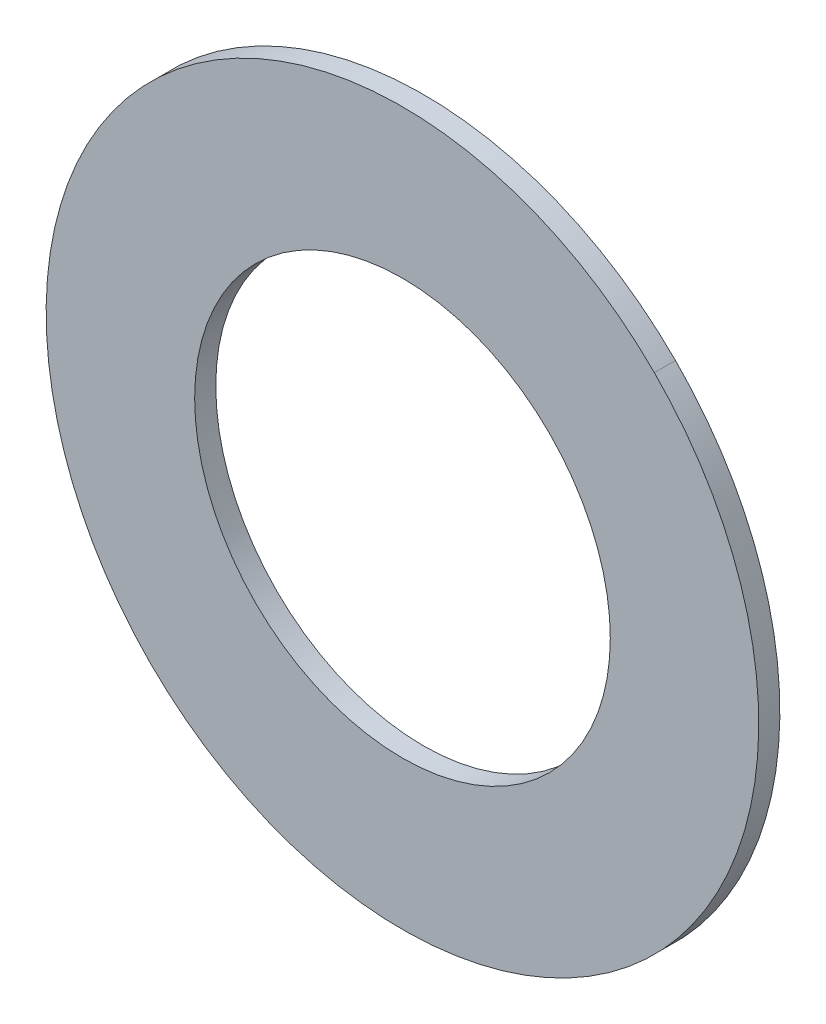
ISO-10303-21;
HEADER;
FILE_DESCRIPTION(('STEP AP214'),'2;1');
FILE_NAME('part.step','',(''),(''),'','','');
FILE_SCHEMA(('AUTOMOTIVE_DESIGN { 1 0 10303 214 1 1 1 1 }'));
ENDSEC;
DATA;
#1=APPLICATION_CONTEXT('core data for automotive mechanical design processes');
#2=APPLICATION_PROTOCOL_DEFINITION('international standard','automotive_design',2000,#1);
#3=PRODUCT_CONTEXT('',#1,'mechanical');
#4=PRODUCT('Part','Part','',(#3));
#5=PRODUCT_RELATED_PRODUCT_CATEGORY('part','',(#4));
#6=PRODUCT_DEFINITION_FORMATION('','',#4);
#7=PRODUCT_DEFINITION_CONTEXT('part definition',#1,'design');
#8=PRODUCT_DEFINITION('design','',#6,#7);
#9=PRODUCT_DEFINITION_SHAPE('','',#8);
#10=(LENGTH_UNIT() NAMED_UNIT(*) SI_UNIT(.MILLI.,.METRE.));
#11=(NAMED_UNIT(*) PLANE_ANGLE_UNIT() SI_UNIT($,.RADIAN.));
#12=(NAMED_UNIT(*) SI_UNIT($,.STERADIAN.) SOLID_ANGLE_UNIT());
#13=UNCERTAINTY_MEASURE_WITH_UNIT(LENGTH_MEASURE(1.E-05),#10,'distance_accuracy_value','');
#14=(GEOMETRIC_REPRESENTATION_CONTEXT(3) GLOBAL_UNCERTAINTY_ASSIGNED_CONTEXT((#13)) GLOBAL_UNIT_ASSIGNED_CONTEXT((#10,
#11,#12)) REPRESENTATION_CONTEXT('',''));
#15=CARTESIAN_POINT('',(0.,0.,0.));
#16=DIRECTION('',(0.,0.,1.));
#17=DIRECTION('',(1.,0.,0.));
#18=AXIS2_PLACEMENT_3D('',#15,#16,#17);
#19=CARTESIAN_POINT('',(114.90900818,94.87582498,0.));
#20=DIRECTION('',(0.707106781235999,0.707106781137096,0.));
#21=DIRECTION('',(0.707106781137096,-0.707106781235999,0.));
#22=AXIS2_PLACEMENT_3D('',#19,#20,#21);
#23=PLANE('',#22);
#24=DIRECTION('',(0.707106781137096,-0.707106781235999,0.));
#25=VECTOR('',#24,1.);
#26=CARTESIAN_POINT('',(114.90900818,94.87582498,0.03556));
#27=LINE('',#26,#25);
#28=CARTESIAN_POINT('',(114.90900818,94.87582498,0.03556));
#29=VERTEX_POINT('',#28);
#30=CARTESIAN_POINT('',(114.90910978,94.87572338,0.03556));
#31=VERTEX_POINT('',#30);
#32=EDGE_CURVE('E11',#29,#31,#27,.T.);
#33=ORIENTED_EDGE('',*,*,#32,.F.);
#34=DIRECTION('',(0.,0.,1.));
#35=VECTOR('',#34,1.);
#36=CARTESIAN_POINT('',(114.90900818,94.87582498,0.));
#37=LINE('',#36,#35);
#38=CARTESIAN_POINT('',(114.90900818,94.87582498,0.));
#39=VERTEX_POINT('',#38);
#40=EDGE_CURVE('E24',#39,#29,#37,.T.);
#41=ORIENTED_EDGE('',*,*,#40,.F.);
#42=DIRECTION('',(0.707106781137096,-0.707106781235999,0.));
#43=VECTOR('',#42,1.);
#44=CARTESIAN_POINT('',(114.90900818,94.87582498,0.));
#45=LINE('',#44,#43);
#46=CARTESIAN_POINT('',(114.90910978,94.87572338,0.));
#47=VERTEX_POINT('',#46);
#48=EDGE_CURVE('E96',#39,#47,#45,.T.);
#49=ORIENTED_EDGE('',*,*,#48,.T.);
#50=DIRECTION('',(0.,0.,1.));
#51=VECTOR('',#50,1.);
#52=CARTESIAN_POINT('',(114.90910978,94.87572338,0.));
#53=LINE('',#52,#51);
#54=EDGE_CURVE('E37',#47,#31,#53,.T.);
#55=ORIENTED_EDGE('',*,*,#54,.T.);
#56=EDGE_LOOP('',(#33,#41,#49,#55));
#57=FACE_BOUND('',#56,.T.);
#58=ADVANCED_FACE('F17',(#57),#23,.F.);
#59=CARTESIAN_POINT('',(115.333272,95.3000888,0.));
#60=DIRECTION('',(0.,0.,-1.));
#61=DIRECTION('',(0.707106781186548,0.707106781186548,0.));
#62=AXIS2_PLACEMENT_3D('',#59,#60,#61);
#63=CYLINDRICAL_SURFACE('',#62,0.599999648268208);
#64=CARTESIAN_POINT('',(115.333272,95.3000888,0.03556));
#65=DIRECTION('',(0.,0.,1.));
#66=DIRECTION('',(0.707106781186548,0.707106781186548,0.));
#67=AXIS2_PLACEMENT_3D('',#64,#65,#66);
#68=CIRCLE('',#67,0.599999648268208);
#69=CARTESIAN_POINT('',(115.75753582,95.72435262,0.03556));
#70=VERTEX_POINT('',#69);
#71=EDGE_CURVE('E92',#70,#29,#68,.T.);
#72=ORIENTED_EDGE('',*,*,#71,.F.);
#73=DIRECTION('',(0.,0.,1.));
#74=VECTOR('',#73,1.);
#75=CARTESIAN_POINT('',(115.75753582,95.72435262,0.));
#76=LINE('',#75,#74);
#77=CARTESIAN_POINT('',(115.75753582,95.72435262,0.));
#78=VERTEX_POINT('',#77);
#79=EDGE_CURVE('E90',#78,#70,#76,.T.);
#80=ORIENTED_EDGE('',*,*,#79,.F.);
#81=CARTESIAN_POINT('',(115.333272,95.3000888,0.));
#82=DIRECTION('',(0.,0.,1.));
#83=DIRECTION('',(0.707106781186548,0.707106781186548,0.));
#84=AXIS2_PLACEMENT_3D('',#81,#82,#83);
#85=CIRCLE('',#84,0.599999648268208);
#86=EDGE_CURVE('E88',#78,#39,#85,.T.);
#87=ORIENTED_EDGE('',*,*,#86,.T.);
#88=ORIENTED_EDGE('',*,*,#40,.T.);
#89=EDGE_LOOP('',(#72,#80,#87,#88));
#90=FACE_BOUND('',#89,.T.);
#91=ADVANCED_FACE('F111',(#90),#63,.T.);
#92=CARTESIAN_POINT('',(115.3333736,95.2999872,0.));
#93=DIRECTION('',(0.,0.,-1.));
#94=DIRECTION('',(-0.707106781186536,-0.707106781186559,0.));
#95=AXIS2_PLACEMENT_3D('',#92,#93,#94);
#96=CYLINDRICAL_SURFACE('',#95,0.599999648268221);
#97=CARTESIAN_POINT('',(115.3333736,95.2999872,0.03556));
#98=DIRECTION('',(0.,0.,1.));
#99=DIRECTION('',(-0.707106781186536,-0.707106781186559,0.));
#100=AXIS2_PLACEMENT_3D('',#97,#98,#99);
#101=CIRCLE('',#100,0.599999648268221);
#102=CARTESIAN_POINT('',(115.75763742,95.72425102,0.03556));
#103=VERTEX_POINT('',#102);
#104=EDGE_CURVE('E85',#31,#103,#101,.T.);
#105=ORIENTED_EDGE('',*,*,#104,.F.);
#106=ORIENTED_EDGE('',*,*,#54,.F.);
#107=CARTESIAN_POINT('',(115.3333736,95.2999872,0.));
#108=DIRECTION('',(0.,0.,1.));
#109=DIRECTION('',(-0.707106781186536,-0.707106781186559,0.));
#110=AXIS2_PLACEMENT_3D('',#107,#108,#109);
#111=CIRCLE('',#110,0.599999648268221);
#112=CARTESIAN_POINT('',(115.75763742,95.72425102,0.));
#113=VERTEX_POINT('',#112);
#114=EDGE_CURVE('E82',#47,#113,#111,.T.);
#115=ORIENTED_EDGE('',*,*,#114,.T.);
#116=DIRECTION('',(0.,0.,1.));
#117=VECTOR('',#116,1.);
#118=CARTESIAN_POINT('',(115.75763742,95.72425102,0.));
#119=LINE('',#118,#117);
#120=EDGE_CURVE('E80',#113,#103,#119,.T.);
#121=ORIENTED_EDGE('',*,*,#120,.T.);
#122=EDGE_LOOP('',(#105,#106,#115,#121));
#123=FACE_BOUND('',#122,.T.);
#124=ADVANCED_FACE('F104',(#123),#96,.T.);
#125=CARTESIAN_POINT('',(115.75763742,95.72425102,0.));
#126=DIRECTION('',(-0.707106781137096,-0.707106781235999,0.));
#127=DIRECTION('',(-0.707106781235999,0.707106781137096,0.));
#128=AXIS2_PLACEMENT_3D('',#125,#126,#127);
#129=PLANE('',#128);
#130=DIRECTION('',(-0.707106781235999,0.707106781137096,0.));
#131=VECTOR('',#130,1.);
#132=CARTESIAN_POINT('',(115.75763742,95.72425102,0.03556));
#133=LINE('',#132,#131);
#134=EDGE_CURVE('E77',#103,#70,#133,.T.);
#135=ORIENTED_EDGE('',*,*,#134,.F.);
#136=ORIENTED_EDGE('',*,*,#120,.F.);
#137=DIRECTION('',(-0.707106781235999,0.707106781137096,0.));
#138=VECTOR('',#137,1.);
#139=CARTESIAN_POINT('',(115.75763742,95.72425102,0.));
#140=LINE('',#139,#138);
#141=EDGE_CURVE('E68',#113,#78,#140,.T.);
#142=ORIENTED_EDGE('',*,*,#141,.T.);
#143=ORIENTED_EDGE('',*,*,#79,.T.);
#144=EDGE_LOOP('',(#135,#136,#142,#143));
#145=FACE_BOUND('',#144,.T.);
#146=ADVANCED_FACE('F110',(#145),#129,.F.);
#147=CARTESIAN_POINT('',(115.3333736,95.2999872,0.));
#148=DIRECTION('',(0.,0.,-1.));
#149=DIRECTION('',(1.,0.,0.));
#150=AXIS2_PLACEMENT_3D('',#147,#148,#149);
#151=CYLINDRICAL_SURFACE('',#150,0.3499993);
#152=DIRECTION('',(0.,0.,1.));
#153=VECTOR('',#152,1.);
#154=CARTESIAN_POINT('',(115.6833729,95.2999872,0.));
#155=LINE('',#154,#153);
#156=CARTESIAN_POINT('',(115.6833729,95.2999872,0.));
#157=VERTEX_POINT('',#156);
#158=CARTESIAN_POINT('',(115.6833729,95.2999872,0.03556));
#159=VERTEX_POINT('',#158);
#160=EDGE_CURVE('E62',#157,#159,#155,.T.);
#161=ORIENTED_EDGE('',*,*,#160,.T.);
#162=CARTESIAN_POINT('',(115.3333736,95.2999872,0.03556));
#163=DIRECTION('',(0.,0.,1.));
#164=DIRECTION('',(1.,0.,0.));
#165=AXIS2_PLACEMENT_3D('',#162,#163,#164);
#166=CIRCLE('',#165,0.3499993);
#167=EDGE_CURVE('E67',#159,#159,#166,.T.);
#168=ORIENTED_EDGE('',*,*,#167,.T.);
#169=ORIENTED_EDGE('',*,*,#160,.F.);
#170=CARTESIAN_POINT('',(115.3333736,95.2999872,0.));
#171=DIRECTION('',(0.,0.,1.));
#172=DIRECTION('',(1.,0.,0.));
#173=AXIS2_PLACEMENT_3D('',#170,#171,#172);
#174=CIRCLE('',#173,0.3499993);
#175=EDGE_CURVE('E65',#157,#157,#174,.T.);
#176=ORIENTED_EDGE('',*,*,#175,.F.);
#177=EDGE_LOOP('',(#161,#168,#169,#176));
#178=FACE_BOUND('',#177,.T.);
#179=ADVANCED_FACE('F64',(#178),#151,.F.);
#180=CARTESIAN_POINT('',(114.90900818,94.87582498,0.));
#181=DIRECTION('',(0.,0.,-1.));
#182=DIRECTION('',(-1.,0.,0.));
#183=AXIS2_PLACEMENT_3D('',#180,#181,#182);
#184=PLANE('',#183);
#185=ORIENTED_EDGE('',*,*,#48,.F.);
#186=ORIENTED_EDGE('',*,*,#86,.F.);
#187=ORIENTED_EDGE('',*,*,#141,.F.);
#188=ORIENTED_EDGE('',*,*,#114,.F.);
#189=EDGE_LOOP('',(#185,#186,#187,#188));
#190=FACE_BOUND('',#189,.T.);
#191=ORIENTED_EDGE('',*,*,#175,.T.);
#192=EDGE_LOOP('',(#191));
#193=FACE_BOUND('',#192,.T.);
#194=ADVANCED_FACE('F71',(#190,#193),#184,.T.);
#195=CARTESIAN_POINT('',(114.90900818,94.87582498,0.03556));
#196=DIRECTION('',(0.,0.,-1.));
#197=DIRECTION('',(-1.,0.,0.));
#198=AXIS2_PLACEMENT_3D('',#195,#196,#197);
#199=PLANE('',#198);
#200=ORIENTED_EDGE('',*,*,#134,.T.);
#201=ORIENTED_EDGE('',*,*,#71,.T.);
#202=ORIENTED_EDGE('',*,*,#32,.T.);
#203=ORIENTED_EDGE('',*,*,#104,.T.);
#204=EDGE_LOOP('',(#200,#201,#202,#203));
#205=FACE_BOUND('',#204,.T.);
#206=ORIENTED_EDGE('',*,*,#167,.F.);
#207=EDGE_LOOP('',(#206));
#208=FACE_BOUND('',#207,.T.);
#209=ADVANCED_FACE('F107',(#205,#208),#199,.F.);
#210=CLOSED_SHELL('',(#58,#91,#124,#146,#179,#194,#209));
#211=MANIFOLD_SOLID_BREP('B1',#210);
#212=ADVANCED_BREP_SHAPE_REPRESENTATION('',(#18,#211),#14);
#213=SHAPE_DEFINITION_REPRESENTATION(#9,#212);
ENDSEC;
END-ISO-10303-21;
